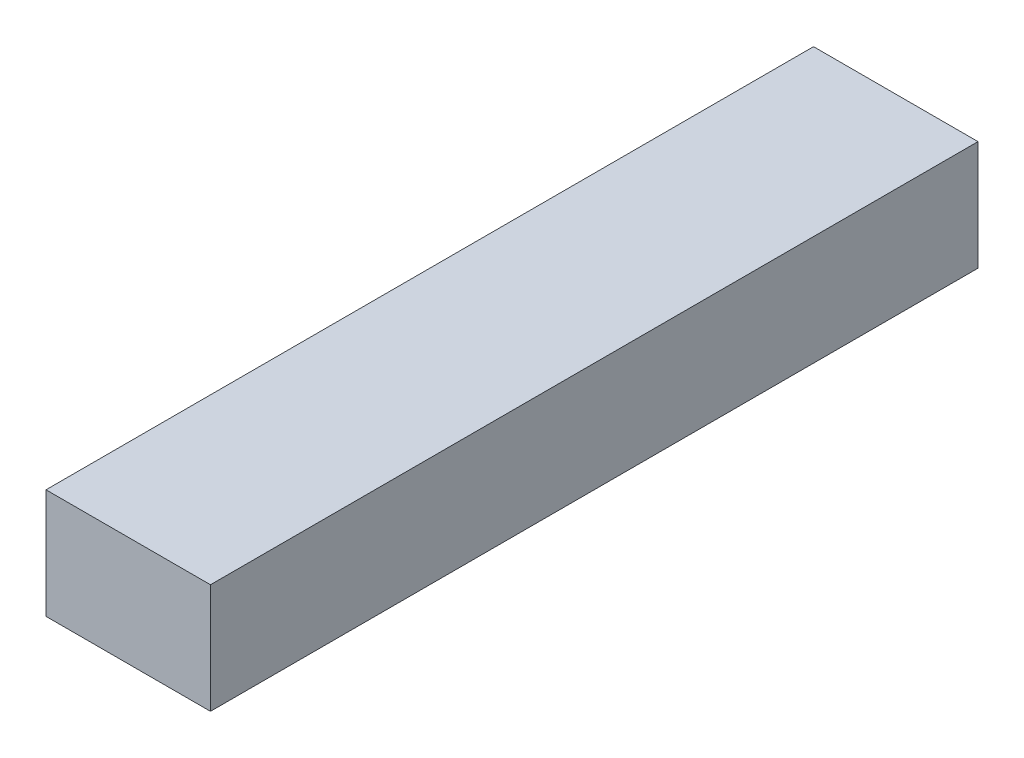
ISO-10303-21;
HEADER;
FILE_DESCRIPTION(('STEP AP214'),'2;1');
FILE_NAME('part.step','',(''),(''),'','','');
FILE_SCHEMA(('AUTOMOTIVE_DESIGN { 1 0 10303 214 1 1 1 1 }'));
ENDSEC;
DATA;
#1=APPLICATION_CONTEXT('core data for automotive mechanical design processes');
#2=APPLICATION_PROTOCOL_DEFINITION('international standard','automotive_design',2000,#1);
#3=PRODUCT_CONTEXT('',#1,'mechanical');
#4=PRODUCT('Part','Part','',(#3));
#5=PRODUCT_RELATED_PRODUCT_CATEGORY('part','',(#4));
#6=PRODUCT_DEFINITION_FORMATION('','',#4);
#7=PRODUCT_DEFINITION_CONTEXT('part definition',#1,'design');
#8=PRODUCT_DEFINITION('design','',#6,#7);
#9=PRODUCT_DEFINITION_SHAPE('','',#8);
#10=(LENGTH_UNIT() NAMED_UNIT(*) SI_UNIT(.MILLI.,.METRE.));
#11=(NAMED_UNIT(*) PLANE_ANGLE_UNIT() SI_UNIT($,.RADIAN.));
#12=(NAMED_UNIT(*) SI_UNIT($,.STERADIAN.) SOLID_ANGLE_UNIT());
#13=UNCERTAINTY_MEASURE_WITH_UNIT(LENGTH_MEASURE(1.E-05),#10,'distance_accuracy_value','');
#14=(GEOMETRIC_REPRESENTATION_CONTEXT(3) GLOBAL_UNCERTAINTY_ASSIGNED_CONTEXT((#13)) GLOBAL_UNIT_ASSIGNED_CONTEXT((#10,
#11,#12)) REPRESENTATION_CONTEXT('',''));
#15=CARTESIAN_POINT('',(0.,0.,0.));
#16=DIRECTION('',(0.,0.,1.));
#17=DIRECTION('',(1.,0.,0.));
#18=AXIS2_PLACEMENT_3D('',#15,#16,#17);
#19=CARTESIAN_POINT('',(0.,5.,0.));
#20=DIRECTION('',(1.,0.,0.));
#21=DIRECTION('',(0.,0.,-1.));
#22=AXIS2_PLACEMENT_3D('',#19,#20,#21);
#23=PLANE('',#22);
#24=DIRECTION('',(0.,0.,1.));
#25=VECTOR('',#24,1.);
#26=CARTESIAN_POINT('',(0.,0.,0.));
#27=LINE('',#26,#25);
#28=CARTESIAN_POINT('',(0.,0.,-35.));
#29=VERTEX_POINT('',#28);
#30=CARTESIAN_POINT('',(0.,0.,0.));
#31=VERTEX_POINT('',#30);
#32=EDGE_CURVE('E96',#29,#31,#27,.T.);
#33=ORIENTED_EDGE('',*,*,#32,.T.);
#34=DIRECTION('',(0.,-1.,0.));
#35=VECTOR('',#34,1.);
#36=CARTESIAN_POINT('',(0.,5.,0.));
#37=LINE('',#36,#35);
#38=CARTESIAN_POINT('',(0.,5.,0.));
#39=VERTEX_POINT('',#38);
#40=EDGE_CURVE('E11',#39,#31,#37,.T.);
#41=ORIENTED_EDGE('',*,*,#40,.F.);
#42=DIRECTION('',(0.,0.,1.));
#43=VECTOR('',#42,1.);
#44=CARTESIAN_POINT('',(0.,5.,0.));
#45=LINE('',#44,#43);
#46=CARTESIAN_POINT('',(0.,5.,-35.));
#47=VERTEX_POINT('',#46);
#48=EDGE_CURVE('E84',#47,#39,#45,.T.);
#49=ORIENTED_EDGE('',*,*,#48,.F.);
#50=DIRECTION('',(0.,-1.,0.));
#51=VECTOR('',#50,1.);
#52=CARTESIAN_POINT('',(0.,5.,-35.));
#53=LINE('',#52,#51);
#54=EDGE_CURVE('E92',#47,#29,#53,.T.);
#55=ORIENTED_EDGE('',*,*,#54,.T.);
#56=EDGE_LOOP('',(#33,#41,#49,#55));
#57=FACE_BOUND('',#56,.T.);
#58=ADVANCED_FACE('F33',(#57),#23,.F.);
#59=CARTESIAN_POINT('',(0.,5.,0.));
#60=DIRECTION('',(0.,0.,-1.));
#61=DIRECTION('',(-1.,0.,0.));
#62=AXIS2_PLACEMENT_3D('',#59,#60,#61);
#63=PLANE('',#62);
#64=DIRECTION('',(1.,0.,0.));
#65=VECTOR('',#64,1.);
#66=CARTESIAN_POINT('',(0.,0.,0.));
#67=LINE('',#66,#65);
#68=CARTESIAN_POINT('',(7.5,0.,0.));
#69=VERTEX_POINT('',#68);
#70=EDGE_CURVE('E88',#31,#69,#67,.T.);
#71=ORIENTED_EDGE('',*,*,#70,.T.);
#72=DIRECTION('',(0.,-1.,0.));
#73=VECTOR('',#72,1.);
#74=CARTESIAN_POINT('',(7.5,5.,0.));
#75=LINE('',#74,#73);
#76=CARTESIAN_POINT('',(7.5,5.,0.));
#77=VERTEX_POINT('',#76);
#78=EDGE_CURVE('E41',#77,#69,#75,.T.);
#79=ORIENTED_EDGE('',*,*,#78,.F.);
#80=DIRECTION('',(1.,0.,0.));
#81=VECTOR('',#80,1.);
#82=CARTESIAN_POINT('',(0.,5.,0.));
#83=LINE('',#82,#81);
#84=EDGE_CURVE('E79',#39,#77,#83,.T.);
#85=ORIENTED_EDGE('',*,*,#84,.F.);
#86=ORIENTED_EDGE('',*,*,#40,.T.);
#87=EDGE_LOOP('',(#71,#79,#85,#86));
#88=FACE_BOUND('',#87,.T.);
#89=ADVANCED_FACE('F87',(#88),#63,.F.);
#90=CARTESIAN_POINT('',(7.5,5.,0.));
#91=DIRECTION('',(-1.,0.,0.));
#92=DIRECTION('',(0.,0.,1.));
#93=AXIS2_PLACEMENT_3D('',#90,#91,#92);
#94=PLANE('',#93);
#95=DIRECTION('',(0.,0.,-1.));
#96=VECTOR('',#95,1.);
#97=CARTESIAN_POINT('',(7.5,0.,0.));
#98=LINE('',#97,#96);
#99=CARTESIAN_POINT('',(7.5,0.,-35.));
#100=VERTEX_POINT('',#99);
#101=EDGE_CURVE('E66',#69,#100,#98,.T.);
#102=ORIENTED_EDGE('',*,*,#101,.T.);
#103=DIRECTION('',(0.,-1.,0.));
#104=VECTOR('',#103,1.);
#105=CARTESIAN_POINT('',(7.5,5.,-35.));
#106=LINE('',#105,#104);
#107=CARTESIAN_POINT('',(7.5,5.,-35.));
#108=VERTEX_POINT('',#107);
#109=EDGE_CURVE('E89',#108,#100,#106,.T.);
#110=ORIENTED_EDGE('',*,*,#109,.F.);
#111=DIRECTION('',(0.,0.,-1.));
#112=VECTOR('',#111,1.);
#113=CARTESIAN_POINT('',(7.5,5.,0.));
#114=LINE('',#113,#112);
#115=EDGE_CURVE('E82',#77,#108,#114,.T.);
#116=ORIENTED_EDGE('',*,*,#115,.F.);
#117=ORIENTED_EDGE('',*,*,#78,.T.);
#118=EDGE_LOOP('',(#102,#110,#116,#117));
#119=FACE_BOUND('',#118,.T.);
#120=ADVANCED_FACE('F90',(#119),#94,.F.);
#121=CARTESIAN_POINT('',(0.,5.,-35.));
#122=DIRECTION('',(0.,0.,1.));
#123=DIRECTION('',(1.,0.,0.));
#124=AXIS2_PLACEMENT_3D('',#121,#122,#123);
#125=PLANE('',#124);
#126=DIRECTION('',(-1.,0.,0.));
#127=VECTOR('',#126,1.);
#128=CARTESIAN_POINT('',(0.,0.,-35.));
#129=LINE('',#128,#127);
#130=EDGE_CURVE('E72',#100,#29,#129,.T.);
#131=ORIENTED_EDGE('',*,*,#130,.T.);
#132=ORIENTED_EDGE('',*,*,#54,.F.);
#133=DIRECTION('',(-1.,0.,0.));
#134=VECTOR('',#133,1.);
#135=CARTESIAN_POINT('',(0.,5.,-35.));
#136=LINE('',#135,#134);
#137=EDGE_CURVE('E49',#108,#47,#136,.T.);
#138=ORIENTED_EDGE('',*,*,#137,.F.);
#139=ORIENTED_EDGE('',*,*,#109,.T.);
#140=EDGE_LOOP('',(#131,#132,#138,#139));
#141=FACE_BOUND('',#140,.T.);
#142=ADVANCED_FACE('F103',(#141),#125,.F.);
#143=CARTESIAN_POINT('',(0.,5.,0.));
#144=DIRECTION('',(0.,-1.,0.));
#145=DIRECTION('',(0.,0.,-1.));
#146=AXIS2_PLACEMENT_3D('',#143,#144,#145);
#147=PLANE('',#146);
#148=ORIENTED_EDGE('',*,*,#48,.T.);
#149=ORIENTED_EDGE('',*,*,#84,.T.);
#150=ORIENTED_EDGE('',*,*,#115,.T.);
#151=ORIENTED_EDGE('',*,*,#137,.T.);
#152=EDGE_LOOP('',(#148,#149,#150,#151));
#153=FACE_BOUND('',#152,.T.);
#154=ADVANCED_FACE('F80',(#153),#147,.F.);
#155=CARTESIAN_POINT('',(0.,0.,0.));
#156=DIRECTION('',(0.,-1.,0.));
#157=DIRECTION('',(0.,0.,-1.));
#158=AXIS2_PLACEMENT_3D('',#155,#156,#157);
#159=PLANE('',#158);
#160=ORIENTED_EDGE('',*,*,#32,.F.);
#161=ORIENTED_EDGE('',*,*,#130,.F.);
#162=ORIENTED_EDGE('',*,*,#101,.F.);
#163=ORIENTED_EDGE('',*,*,#70,.F.);
#164=EDGE_LOOP('',(#160,#161,#162,#163));
#165=FACE_BOUND('',#164,.T.);
#166=ADVANCED_FACE('F106',(#165),#159,.T.);
#167=CLOSED_SHELL('',(#58,#89,#120,#142,#154,#166));
#168=MANIFOLD_SOLID_BREP('B2',#167);
#169=ADVANCED_BREP_SHAPE_REPRESENTATION('',(#18,#168),#14);
#170=SHAPE_DEFINITION_REPRESENTATION(#9,#169);
ENDSEC;
END-ISO-10303-21;
